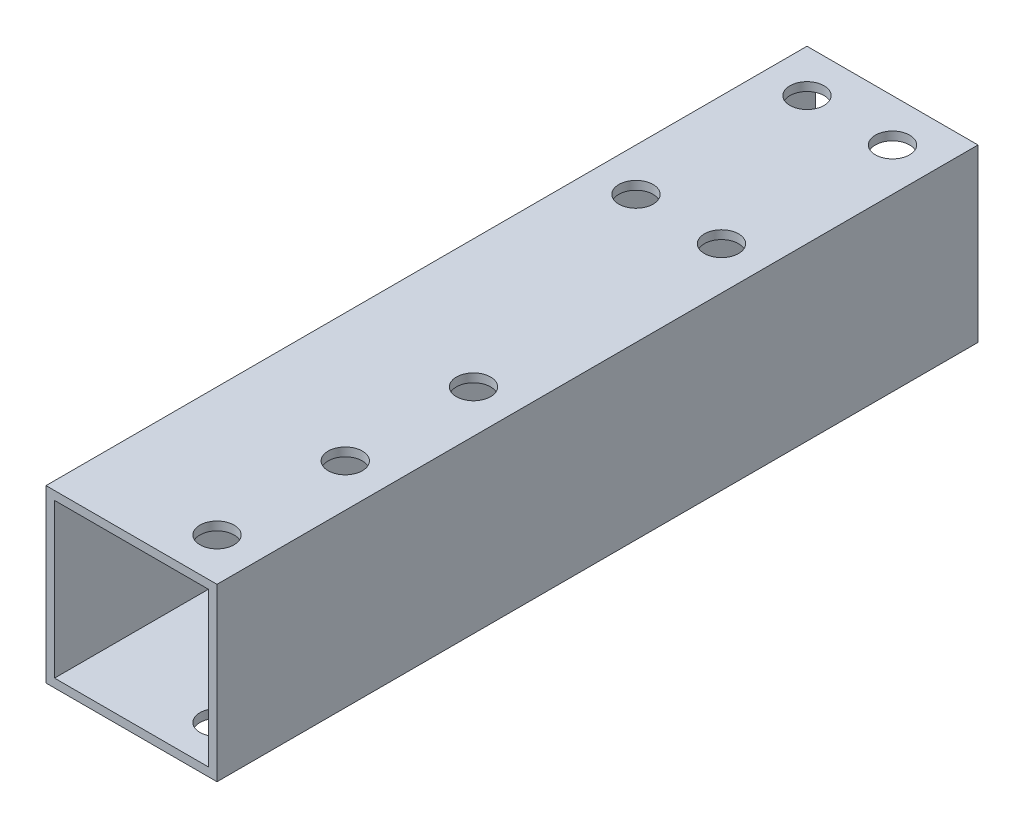
ISO-10303-21;
HEADER;
FILE_DESCRIPTION(('STEP AP214'),'2;1');
FILE_NAME('part.step','',(''),(''),'','','');
FILE_SCHEMA(('AUTOMOTIVE_DESIGN { 1 0 10303 214 1 1 1 1 }'));
ENDSEC;
DATA;
#1=APPLICATION_CONTEXT('core data for automotive mechanical design processes');
#2=APPLICATION_PROTOCOL_DEFINITION('international standard','automotive_design',2000,#1);
#3=PRODUCT_CONTEXT('',#1,'mechanical');
#4=PRODUCT('Part','Part','',(#3));
#5=PRODUCT_RELATED_PRODUCT_CATEGORY('part','',(#4));
#6=PRODUCT_DEFINITION_FORMATION('','',#4);
#7=PRODUCT_DEFINITION_CONTEXT('part definition',#1,'design');
#8=PRODUCT_DEFINITION('design','',#6,#7);
#9=PRODUCT_DEFINITION_SHAPE('','',#8);
#10=(LENGTH_UNIT() NAMED_UNIT(*) SI_UNIT(.MILLI.,.METRE.));
#11=(NAMED_UNIT(*) PLANE_ANGLE_UNIT() SI_UNIT($,.RADIAN.));
#12=(NAMED_UNIT(*) SI_UNIT($,.STERADIAN.) SOLID_ANGLE_UNIT());
#13=UNCERTAINTY_MEASURE_WITH_UNIT(LENGTH_MEASURE(1.E-05),#10,'distance_accuracy_value','');
#14=(GEOMETRIC_REPRESENTATION_CONTEXT(3) GLOBAL_UNCERTAINTY_ASSIGNED_CONTEXT((#13)) GLOBAL_UNIT_ASSIGNED_CONTEXT((#10,
#11,#12)) REPRESENTATION_CONTEXT('',''));
#15=CARTESIAN_POINT('',(0.,0.,0.));
#16=DIRECTION('',(0.,0.,1.));
#17=DIRECTION('',(1.,0.,0.));
#18=AXIS2_PLACEMENT_3D('',#15,#16,#17);
#19=CARTESIAN_POINT('',(0.,0.,89.));
#20=DIRECTION('',(0.,0.,1.));
#21=DIRECTION('',(1.,0.,0.));
#22=AXIS2_PLACEMENT_3D('',#19,#20,#21);
#23=PLANE('',#22);
#24=DIRECTION('',(0.,-1.,0.));
#25=VECTOR('',#24,1.);
#26=CARTESIAN_POINT('',(0.,0.,89.));
#27=LINE('',#26,#25);
#28=CARTESIAN_POINT('',(0.,20.,89.));
#29=VERTEX_POINT('',#28);
#30=CARTESIAN_POINT('',(0.,0.,89.));
#31=VERTEX_POINT('',#30);
#32=EDGE_CURVE('E165',#29,#31,#27,.T.);
#33=ORIENTED_EDGE('',*,*,#32,.T.);
#34=DIRECTION('',(1.,0.,0.));
#35=VECTOR('',#34,1.);
#36=CARTESIAN_POINT('',(0.,0.,89.));
#37=LINE('',#36,#35);
#38=CARTESIAN_POINT('',(20.,0.,89.));
#39=VERTEX_POINT('',#38);
#40=EDGE_CURVE('E168',#31,#39,#37,.T.);
#41=ORIENTED_EDGE('',*,*,#40,.T.);
#42=DIRECTION('',(0.,1.,0.));
#43=VECTOR('',#42,1.);
#44=CARTESIAN_POINT('',(20.,0.,89.));
#45=LINE('',#44,#43);
#46=CARTESIAN_POINT('',(20.,20.,89.));
#47=VERTEX_POINT('',#46);
#48=EDGE_CURVE('E171',#39,#47,#45,.T.);
#49=ORIENTED_EDGE('',*,*,#48,.T.);
#50=DIRECTION('',(-1.,0.,0.));
#51=VECTOR('',#50,1.);
#52=CARTESIAN_POINT('',(0.,20.,89.));
#53=LINE('',#52,#51);
#54=EDGE_CURVE('E173',#47,#29,#53,.T.);
#55=ORIENTED_EDGE('',*,*,#54,.T.);
#56=EDGE_LOOP('',(#33,#41,#49,#55));
#57=FACE_BOUND('',#56,.T.);
#58=DIRECTION('',(1.,0.,0.));
#59=VECTOR('',#58,1.);
#60=CARTESIAN_POINT('',(0.,1.,89.));
#61=LINE('',#60,#59);
#62=CARTESIAN_POINT('',(1.,1.,89.));
#63=VERTEX_POINT('',#62);
#64=CARTESIAN_POINT('',(19.,1.,89.));
#65=VERTEX_POINT('',#64);
#66=EDGE_CURVE('E135',#63,#65,#61,.T.);
#67=ORIENTED_EDGE('',*,*,#66,.F.);
#68=DIRECTION('',(0.,-1.,0.));
#69=VECTOR('',#68,1.);
#70=CARTESIAN_POINT('',(1.,0.,89.));
#71=LINE('',#70,#69);
#72=CARTESIAN_POINT('',(1.,19.,89.));
#73=VERTEX_POINT('',#72);
#74=EDGE_CURVE('E127',#73,#63,#71,.T.);
#75=ORIENTED_EDGE('',*,*,#74,.F.);
#76=DIRECTION('',(-1.,0.,0.));
#77=VECTOR('',#76,1.);
#78=CARTESIAN_POINT('',(0.,19.,89.));
#79=LINE('',#78,#77);
#80=CARTESIAN_POINT('',(19.,19.,89.));
#81=VERTEX_POINT('',#80);
#82=EDGE_CURVE('E149',#81,#73,#79,.T.);
#83=ORIENTED_EDGE('',*,*,#82,.F.);
#84=DIRECTION('',(0.,1.,0.));
#85=VECTOR('',#84,1.);
#86=CARTESIAN_POINT('',(19.,0.,89.));
#87=LINE('',#86,#85);
#88=EDGE_CURVE('E147',#65,#81,#87,.T.);
#89=ORIENTED_EDGE('',*,*,#88,.F.);
#90=EDGE_LOOP('',(#67,#75,#83,#89));
#91=FACE_BOUND('',#90,.T.);
#92=ADVANCED_FACE('F60',(#57,#91),#23,.T.);
#93=CARTESIAN_POINT('',(0.,0.,0.));
#94=DIRECTION('',(0.,0.,1.));
#95=DIRECTION('',(1.,0.,0.));
#96=AXIS2_PLACEMENT_3D('',#93,#94,#95);
#97=PLANE('',#96);
#98=DIRECTION('',(0.,-1.,0.));
#99=VECTOR('',#98,1.);
#100=CARTESIAN_POINT('',(0.,0.,0.));
#101=LINE('',#100,#99);
#102=CARTESIAN_POINT('',(0.,20.,0.));
#103=VERTEX_POINT('',#102);
#104=CARTESIAN_POINT('',(0.,0.,0.));
#105=VERTEX_POINT('',#104);
#106=EDGE_CURVE('E143',#103,#105,#101,.T.);
#107=ORIENTED_EDGE('',*,*,#106,.F.);
#108=DIRECTION('',(-1.,0.,0.));
#109=VECTOR('',#108,1.);
#110=CARTESIAN_POINT('',(0.,20.,0.));
#111=LINE('',#110,#109);
#112=CARTESIAN_POINT('',(20.,20.,0.));
#113=VERTEX_POINT('',#112);
#114=EDGE_CURVE('E169',#113,#103,#111,.T.);
#115=ORIENTED_EDGE('',*,*,#114,.F.);
#116=DIRECTION('',(0.,1.,0.));
#117=VECTOR('',#116,1.);
#118=CARTESIAN_POINT('',(20.,0.,0.));
#119=LINE('',#118,#117);
#120=CARTESIAN_POINT('',(20.,0.,0.));
#121=VERTEX_POINT('',#120);
#122=EDGE_CURVE('E180',#121,#113,#119,.T.);
#123=ORIENTED_EDGE('',*,*,#122,.F.);
#124=DIRECTION('',(1.,0.,0.));
#125=VECTOR('',#124,1.);
#126=CARTESIAN_POINT('',(0.,0.,0.));
#127=LINE('',#126,#125);
#128=EDGE_CURVE('E178',#105,#121,#127,.T.);
#129=ORIENTED_EDGE('',*,*,#128,.F.);
#130=EDGE_LOOP('',(#107,#115,#123,#129));
#131=FACE_BOUND('',#130,.T.);
#132=DIRECTION('',(0.,-1.,0.));
#133=VECTOR('',#132,1.);
#134=CARTESIAN_POINT('',(1.,0.,0.));
#135=LINE('',#134,#133);
#136=CARTESIAN_POINT('',(1.,19.,0.));
#137=VERTEX_POINT('',#136);
#138=CARTESIAN_POINT('',(1.,1.,0.));
#139=VERTEX_POINT('',#138);
#140=EDGE_CURVE('E85',#137,#139,#135,.T.);
#141=ORIENTED_EDGE('',*,*,#140,.T.);
#142=DIRECTION('',(1.,0.,0.));
#143=VECTOR('',#142,1.);
#144=CARTESIAN_POINT('',(0.,1.,0.));
#145=LINE('',#144,#143);
#146=CARTESIAN_POINT('',(19.,1.,0.));
#147=VERTEX_POINT('',#146);
#148=EDGE_CURVE('E142',#139,#147,#145,.T.);
#149=ORIENTED_EDGE('',*,*,#148,.T.);
#150=DIRECTION('',(0.,1.,0.));
#151=VECTOR('',#150,1.);
#152=CARTESIAN_POINT('',(19.,0.,0.));
#153=LINE('',#152,#151);
#154=CARTESIAN_POINT('',(19.,19.,0.));
#155=VERTEX_POINT('',#154);
#156=EDGE_CURVE('E157',#147,#155,#153,.T.);
#157=ORIENTED_EDGE('',*,*,#156,.T.);
#158=DIRECTION('',(-1.,0.,0.));
#159=VECTOR('',#158,1.);
#160=CARTESIAN_POINT('',(0.,19.,0.));
#161=LINE('',#160,#159);
#162=EDGE_CURVE('E136',#155,#137,#161,.T.);
#163=ORIENTED_EDGE('',*,*,#162,.T.);
#164=EDGE_LOOP('',(#141,#149,#157,#163));
#165=FACE_BOUND('',#164,.T.);
#166=ADVANCED_FACE('F250',(#131,#165),#97,.F.);
#167=CARTESIAN_POINT('',(0.,0.,89.));
#168=DIRECTION('',(1.,0.,0.));
#169=DIRECTION('',(0.,0.,-1.));
#170=AXIS2_PLACEMENT_3D('',#167,#168,#169);
#171=PLANE('',#170);
#172=ORIENTED_EDGE('',*,*,#106,.T.);
#173=DIRECTION('',(0.,0.,-1.));
#174=VECTOR('',#173,1.);
#175=CARTESIAN_POINT('',(0.,0.,89.));
#176=LINE('',#175,#174);
#177=EDGE_CURVE('E12',#31,#105,#176,.T.);
#178=ORIENTED_EDGE('',*,*,#177,.F.);
#179=ORIENTED_EDGE('',*,*,#32,.F.);
#180=DIRECTION('',(0.,0.,-1.));
#181=VECTOR('',#180,1.);
#182=CARTESIAN_POINT('',(0.,20.,89.));
#183=LINE('',#182,#181);
#184=EDGE_CURVE('E175',#29,#103,#183,.T.);
#185=ORIENTED_EDGE('',*,*,#184,.T.);
#186=EDGE_LOOP('',(#172,#178,#179,#185));
#187=FACE_BOUND('',#186,.T.);
#188=ADVANCED_FACE('F62',(#187),#171,.F.);
#189=CARTESIAN_POINT('',(0.,0.,89.));
#190=DIRECTION('',(0.,1.,0.));
#191=DIRECTION('',(0.,0.,1.));
#192=AXIS2_PLACEMENT_3D('',#189,#190,#191);
#193=PLANE('',#192);
#194=CARTESIAN_POINT('',(15.,0.,84.));
#195=DIRECTION('',(0.,1.,0.));
#196=DIRECTION('',(0.,0.,1.));
#197=AXIS2_PLACEMENT_3D('',#194,#195,#196);
#198=CIRCLE('',#197,2.00000000000001);
#199=CARTESIAN_POINT('',(15.,0.,86.));
#200=VERTEX_POINT('',#199);
#201=EDGE_CURVE('E286',#200,#200,#198,.T.);
#202=ORIENTED_EDGE('',*,*,#201,.T.);
#203=EDGE_LOOP('',(#202));
#204=FACE_BOUND('',#203,.T.);
#205=CARTESIAN_POINT('',(15.,0.,25.));
#206=DIRECTION('',(0.,1.,0.));
#207=DIRECTION('',(0.,0.,1.));
#208=AXIS2_PLACEMENT_3D('',#205,#206,#207);
#209=CIRCLE('',#208,2.);
#210=CARTESIAN_POINT('',(15.,0.,27.));
#211=VERTEX_POINT('',#210);
#212=EDGE_CURVE('E290',#211,#211,#209,.T.);
#213=ORIENTED_EDGE('',*,*,#212,.T.);
#214=EDGE_LOOP('',(#213));
#215=FACE_BOUND('',#214,.T.);
#216=CARTESIAN_POINT('',(5.,0.,25.));
#217=DIRECTION('',(0.,1.,0.));
#218=DIRECTION('',(0.,0.,1.));
#219=AXIS2_PLACEMENT_3D('',#216,#217,#218);
#220=CIRCLE('',#219,2.);
#221=CARTESIAN_POINT('',(5.,0.,27.));
#222=VERTEX_POINT('',#221);
#223=EDGE_CURVE('E294',#222,#222,#220,.T.);
#224=ORIENTED_EDGE('',*,*,#223,.T.);
#225=EDGE_LOOP('',(#224));
#226=FACE_BOUND('',#225,.T.);
#227=CARTESIAN_POINT('',(15.,0.,5.));
#228=DIRECTION('',(0.,1.,0.));
#229=DIRECTION('',(0.,0.,1.));
#230=AXIS2_PLACEMENT_3D('',#227,#228,#229);
#231=CIRCLE('',#230,2.);
#232=CARTESIAN_POINT('',(15.,0.,7.));
#233=VERTEX_POINT('',#232);
#234=EDGE_CURVE('E298',#233,#233,#231,.T.);
#235=ORIENTED_EDGE('',*,*,#234,.T.);
#236=EDGE_LOOP('',(#235));
#237=FACE_BOUND('',#236,.T.);
#238=CARTESIAN_POINT('',(15.,0.,69.));
#239=DIRECTION('',(0.,1.,0.));
#240=DIRECTION('',(0.,0.,1.));
#241=AXIS2_PLACEMENT_3D('',#238,#239,#240);
#242=CIRCLE('',#241,2.00000000000001);
#243=CARTESIAN_POINT('',(15.,0.,71.));
#244=VERTEX_POINT('',#243);
#245=EDGE_CURVE('E302',#244,#244,#242,.T.);
#246=ORIENTED_EDGE('',*,*,#245,.T.);
#247=EDGE_LOOP('',(#246));
#248=FACE_BOUND('',#247,.T.);
#249=CARTESIAN_POINT('',(15.,0.,54.));
#250=DIRECTION('',(0.,1.,0.));
#251=DIRECTION('',(0.,0.,1.));
#252=AXIS2_PLACEMENT_3D('',#249,#250,#251);
#253=CIRCLE('',#252,2.00000000000001);
#254=CARTESIAN_POINT('',(15.,0.,56.));
#255=VERTEX_POINT('',#254);
#256=EDGE_CURVE('E306',#255,#255,#253,.T.);
#257=ORIENTED_EDGE('',*,*,#256,.T.);
#258=EDGE_LOOP('',(#257));
#259=FACE_BOUND('',#258,.T.);
#260=CARTESIAN_POINT('',(5.,0.,5.));
#261=DIRECTION('',(0.,1.,0.));
#262=DIRECTION('',(0.,0.,1.));
#263=AXIS2_PLACEMENT_3D('',#260,#261,#262);
#264=CIRCLE('',#263,2.);
#265=CARTESIAN_POINT('',(5.,0.,7.));
#266=VERTEX_POINT('',#265);
#267=EDGE_CURVE('E194',#266,#266,#264,.T.);
#268=ORIENTED_EDGE('',*,*,#267,.T.);
#269=EDGE_LOOP('',(#268));
#270=FACE_BOUND('',#269,.T.);
#271=ORIENTED_EDGE('',*,*,#128,.T.);
#272=DIRECTION('',(0.,0.,-1.));
#273=VECTOR('',#272,1.);
#274=CARTESIAN_POINT('',(20.,0.,89.));
#275=LINE('',#274,#273);
#276=EDGE_CURVE('E69',#39,#121,#275,.T.);
#277=ORIENTED_EDGE('',*,*,#276,.F.);
#278=ORIENTED_EDGE('',*,*,#40,.F.);
#279=ORIENTED_EDGE('',*,*,#177,.T.);
#280=EDGE_LOOP('',(#271,#277,#278,#279));
#281=FACE_BOUND('',#280,.T.);
#282=ADVANCED_FACE('F275',(#204,#215,#226,#237,#248,#259,#270,#281),#193,.F.);
#283=CARTESIAN_POINT('',(20.,0.,89.));
#284=DIRECTION('',(-1.,0.,0.));
#285=DIRECTION('',(0.,0.,1.));
#286=AXIS2_PLACEMENT_3D('',#283,#284,#285);
#287=PLANE('',#286);
#288=ORIENTED_EDGE('',*,*,#122,.T.);
#289=DIRECTION('',(0.,0.,-1.));
#290=VECTOR('',#289,1.);
#291=CARTESIAN_POINT('',(20.,20.,89.));
#292=LINE('',#291,#290);
#293=EDGE_CURVE('E185',#47,#113,#292,.T.);
#294=ORIENTED_EDGE('',*,*,#293,.F.);
#295=ORIENTED_EDGE('',*,*,#48,.F.);
#296=ORIENTED_EDGE('',*,*,#276,.T.);
#297=EDGE_LOOP('',(#288,#294,#295,#296));
#298=FACE_BOUND('',#297,.T.);
#299=ADVANCED_FACE('F272',(#298),#287,.F.);
#300=CARTESIAN_POINT('',(0.,20.,89.));
#301=DIRECTION('',(0.,-1.,0.));
#302=DIRECTION('',(0.,0.,-1.));
#303=AXIS2_PLACEMENT_3D('',#300,#301,#302);
#304=PLANE('',#303);
#305=CARTESIAN_POINT('',(15.,20.,84.));
#306=DIRECTION('',(0.,1.,0.));
#307=DIRECTION('',(0.,0.,1.));
#308=AXIS2_PLACEMENT_3D('',#305,#306,#307);
#309=CIRCLE('',#308,2.00000000000001);
#310=CARTESIAN_POINT('',(15.,20.,86.));
#311=VERTEX_POINT('',#310);
#312=EDGE_CURVE('E404',#311,#311,#309,.T.);
#313=ORIENTED_EDGE('',*,*,#312,.F.);
#314=EDGE_LOOP('',(#313));
#315=FACE_BOUND('',#314,.T.);
#316=CARTESIAN_POINT('',(15.,20.,25.));
#317=DIRECTION('',(0.,1.,0.));
#318=DIRECTION('',(0.,0.,1.));
#319=AXIS2_PLACEMENT_3D('',#316,#317,#318);
#320=CIRCLE('',#319,2.);
#321=CARTESIAN_POINT('',(15.,20.,27.));
#322=VERTEX_POINT('',#321);
#323=EDGE_CURVE('E408',#322,#322,#320,.T.);
#324=ORIENTED_EDGE('',*,*,#323,.F.);
#325=EDGE_LOOP('',(#324));
#326=FACE_BOUND('',#325,.T.);
#327=CARTESIAN_POINT('',(5.,20.,25.));
#328=DIRECTION('',(0.,1.,0.));
#329=DIRECTION('',(0.,0.,1.));
#330=AXIS2_PLACEMENT_3D('',#327,#328,#329);
#331=CIRCLE('',#330,2.);
#332=CARTESIAN_POINT('',(5.,20.,27.));
#333=VERTEX_POINT('',#332);
#334=EDGE_CURVE('E327',#333,#333,#331,.T.);
#335=ORIENTED_EDGE('',*,*,#334,.F.);
#336=EDGE_LOOP('',(#335));
#337=FACE_BOUND('',#336,.T.);
#338=CARTESIAN_POINT('',(15.,20.,5.));
#339=DIRECTION('',(0.,1.,0.));
#340=DIRECTION('',(0.,0.,1.));
#341=AXIS2_PLACEMENT_3D('',#338,#339,#340);
#342=CIRCLE('',#341,2.);
#343=CARTESIAN_POINT('',(15.,20.,7.));
#344=VERTEX_POINT('',#343);
#345=EDGE_CURVE('E398',#344,#344,#342,.T.);
#346=ORIENTED_EDGE('',*,*,#345,.F.);
#347=EDGE_LOOP('',(#346));
#348=FACE_BOUND('',#347,.T.);
#349=CARTESIAN_POINT('',(15.,20.,69.));
#350=DIRECTION('',(0.,1.,0.));
#351=DIRECTION('',(0.,0.,1.));
#352=AXIS2_PLACEMENT_3D('',#349,#350,#351);
#353=CIRCLE('',#352,2.00000000000001);
#354=CARTESIAN_POINT('',(15.,20.,71.));
#355=VERTEX_POINT('',#354);
#356=EDGE_CURVE('E416',#355,#355,#353,.T.);
#357=ORIENTED_EDGE('',*,*,#356,.F.);
#358=EDGE_LOOP('',(#357));
#359=FACE_BOUND('',#358,.T.);
#360=CARTESIAN_POINT('',(15.,20.,54.));
#361=DIRECTION('',(0.,1.,0.));
#362=DIRECTION('',(0.,0.,1.));
#363=AXIS2_PLACEMENT_3D('',#360,#361,#362);
#364=CIRCLE('',#363,2.00000000000001);
#365=CARTESIAN_POINT('',(15.,20.,56.));
#366=VERTEX_POINT('',#365);
#367=EDGE_CURVE('E412',#366,#366,#364,.T.);
#368=ORIENTED_EDGE('',*,*,#367,.F.);
#369=EDGE_LOOP('',(#368));
#370=FACE_BOUND('',#369,.T.);
#371=CARTESIAN_POINT('',(5.,20.,5.));
#372=DIRECTION('',(0.,1.,0.));
#373=DIRECTION('',(0.,0.,1.));
#374=AXIS2_PLACEMENT_3D('',#371,#372,#373);
#375=CIRCLE('',#374,2.);
#376=CARTESIAN_POINT('',(5.,20.,7.));
#377=VERTEX_POINT('',#376);
#378=EDGE_CURVE('E322',#377,#377,#375,.T.);
#379=ORIENTED_EDGE('',*,*,#378,.F.);
#380=EDGE_LOOP('',(#379));
#381=FACE_BOUND('',#380,.T.);
#382=ORIENTED_EDGE('',*,*,#114,.T.);
#383=ORIENTED_EDGE('',*,*,#184,.F.);
#384=ORIENTED_EDGE('',*,*,#54,.F.);
#385=ORIENTED_EDGE('',*,*,#293,.T.);
#386=EDGE_LOOP('',(#382,#383,#384,#385));
#387=FACE_BOUND('',#386,.T.);
#388=ADVANCED_FACE('F269',(#315,#326,#337,#348,#359,#370,#381,#387),#304,.F.);
#389=CARTESIAN_POINT('',(1.,0.,89.));
#390=DIRECTION('',(1.,0.,0.));
#391=DIRECTION('',(0.,0.,-1.));
#392=AXIS2_PLACEMENT_3D('',#389,#390,#391);
#393=PLANE('',#392);
#394=ORIENTED_EDGE('',*,*,#140,.F.);
#395=DIRECTION('',(0.,0.,-1.));
#396=VECTOR('',#395,1.);
#397=CARTESIAN_POINT('',(1.,19.,89.));
#398=LINE('',#397,#396);
#399=EDGE_CURVE('E131',#73,#137,#398,.T.);
#400=ORIENTED_EDGE('',*,*,#399,.F.);
#401=ORIENTED_EDGE('',*,*,#74,.T.);
#402=DIRECTION('',(0.,0.,-1.));
#403=VECTOR('',#402,1.);
#404=CARTESIAN_POINT('',(1.,1.,89.));
#405=LINE('',#404,#403);
#406=EDGE_CURVE('E130',#63,#139,#405,.T.);
#407=ORIENTED_EDGE('',*,*,#406,.T.);
#408=EDGE_LOOP('',(#394,#400,#401,#407));
#409=FACE_BOUND('',#408,.T.);
#410=ADVANCED_FACE('F129',(#409),#393,.T.);
#411=CARTESIAN_POINT('',(0.,1.,89.));
#412=DIRECTION('',(0.,1.,0.));
#413=DIRECTION('',(0.,0.,1.));
#414=AXIS2_PLACEMENT_3D('',#411,#412,#413);
#415=PLANE('',#414);
#416=CARTESIAN_POINT('',(15.,1.,84.));
#417=DIRECTION('',(0.,1.,0.));
#418=DIRECTION('',(0.,0.,1.));
#419=AXIS2_PLACEMENT_3D('',#416,#417,#418);
#420=CIRCLE('',#419,2.00000000000001);
#421=CARTESIAN_POINT('',(15.,1.,86.));
#422=VERTEX_POINT('',#421);
#423=EDGE_CURVE('E155',#422,#422,#420,.T.);
#424=ORIENTED_EDGE('',*,*,#423,.F.);
#425=EDGE_LOOP('',(#424));
#426=FACE_BOUND('',#425,.T.);
#427=CARTESIAN_POINT('',(15.,1.,25.));
#428=DIRECTION('',(0.,1.,0.));
#429=DIRECTION('',(0.,0.,1.));
#430=AXIS2_PLACEMENT_3D('',#427,#428,#429);
#431=CIRCLE('',#430,2.);
#432=CARTESIAN_POINT('',(15.,1.,27.));
#433=VERTEX_POINT('',#432);
#434=EDGE_CURVE('E212',#433,#433,#431,.T.);
#435=ORIENTED_EDGE('',*,*,#434,.F.);
#436=EDGE_LOOP('',(#435));
#437=FACE_BOUND('',#436,.T.);
#438=CARTESIAN_POINT('',(5.,1.,25.));
#439=DIRECTION('',(0.,1.,0.));
#440=DIRECTION('',(0.,0.,1.));
#441=AXIS2_PLACEMENT_3D('',#438,#439,#440);
#442=CIRCLE('',#441,2.);
#443=CARTESIAN_POINT('',(5.,1.,27.));
#444=VERTEX_POINT('',#443);
#445=EDGE_CURVE('E209',#444,#444,#442,.T.);
#446=ORIENTED_EDGE('',*,*,#445,.F.);
#447=EDGE_LOOP('',(#446));
#448=FACE_BOUND('',#447,.T.);
#449=CARTESIAN_POINT('',(15.,1.,5.));
#450=DIRECTION('',(0.,1.,0.));
#451=DIRECTION('',(0.,0.,1.));
#452=AXIS2_PLACEMENT_3D('',#449,#450,#451);
#453=CIRCLE('',#452,2.);
#454=CARTESIAN_POINT('',(15.,1.,7.));
#455=VERTEX_POINT('',#454);
#456=EDGE_CURVE('E206',#455,#455,#453,.T.);
#457=ORIENTED_EDGE('',*,*,#456,.F.);
#458=EDGE_LOOP('',(#457));
#459=FACE_BOUND('',#458,.T.);
#460=CARTESIAN_POINT('',(15.,1.,69.));
#461=DIRECTION('',(0.,1.,0.));
#462=DIRECTION('',(0.,0.,1.));
#463=AXIS2_PLACEMENT_3D('',#460,#461,#462);
#464=CIRCLE('',#463,2.00000000000001);
#465=CARTESIAN_POINT('',(15.,1.,71.));
#466=VERTEX_POINT('',#465);
#467=EDGE_CURVE('E202',#466,#466,#464,.T.);
#468=ORIENTED_EDGE('',*,*,#467,.F.);
#469=EDGE_LOOP('',(#468));
#470=FACE_BOUND('',#469,.T.);
#471=CARTESIAN_POINT('',(15.,1.,54.));
#472=DIRECTION('',(0.,1.,0.));
#473=DIRECTION('',(0.,0.,1.));
#474=AXIS2_PLACEMENT_3D('',#471,#472,#473);
#475=CIRCLE('',#474,2.00000000000001);
#476=CARTESIAN_POINT('',(15.,1.,56.));
#477=VERTEX_POINT('',#476);
#478=EDGE_CURVE('E198',#477,#477,#475,.T.);
#479=ORIENTED_EDGE('',*,*,#478,.F.);
#480=EDGE_LOOP('',(#479));
#481=FACE_BOUND('',#480,.T.);
#482=CARTESIAN_POINT('',(5.,1.,5.));
#483=DIRECTION('',(0.,1.,0.));
#484=DIRECTION('',(0.,0.,1.));
#485=AXIS2_PLACEMENT_3D('',#482,#483,#484);
#486=CIRCLE('',#485,2.);
#487=CARTESIAN_POINT('',(5.,1.,7.));
#488=VERTEX_POINT('',#487);
#489=EDGE_CURVE('E193',#488,#488,#486,.T.);
#490=ORIENTED_EDGE('',*,*,#489,.F.);
#491=EDGE_LOOP('',(#490));
#492=FACE_BOUND('',#491,.T.);
#493=ORIENTED_EDGE('',*,*,#148,.F.);
#494=ORIENTED_EDGE('',*,*,#406,.F.);
#495=ORIENTED_EDGE('',*,*,#66,.T.);
#496=DIRECTION('',(0.,0.,-1.));
#497=VECTOR('',#496,1.);
#498=CARTESIAN_POINT('',(19.,1.,89.));
#499=LINE('',#498,#497);
#500=EDGE_CURVE('E144',#65,#147,#499,.T.);
#501=ORIENTED_EDGE('',*,*,#500,.T.);
#502=EDGE_LOOP('',(#493,#494,#495,#501));
#503=FACE_BOUND('',#502,.T.);
#504=ADVANCED_FACE('F139',(#426,#437,#448,#459,#470,#481,#492,#503),#415,.T.);
#505=CARTESIAN_POINT('',(19.,0.,89.));
#506=DIRECTION('',(-1.,0.,0.));
#507=DIRECTION('',(0.,0.,1.));
#508=AXIS2_PLACEMENT_3D('',#505,#506,#507);
#509=PLANE('',#508);
#510=ORIENTED_EDGE('',*,*,#156,.F.);
#511=ORIENTED_EDGE('',*,*,#500,.F.);
#512=ORIENTED_EDGE('',*,*,#88,.T.);
#513=DIRECTION('',(0.,0.,-1.));
#514=VECTOR('',#513,1.);
#515=CARTESIAN_POINT('',(19.,19.,89.));
#516=LINE('',#515,#514);
#517=EDGE_CURVE('E77',#81,#155,#516,.T.);
#518=ORIENTED_EDGE('',*,*,#517,.T.);
#519=EDGE_LOOP('',(#510,#511,#512,#518));
#520=FACE_BOUND('',#519,.T.);
#521=ADVANCED_FACE('F236',(#520),#509,.T.);
#522=CARTESIAN_POINT('',(0.,19.,89.));
#523=DIRECTION('',(0.,-1.,0.));
#524=DIRECTION('',(0.,0.,-1.));
#525=AXIS2_PLACEMENT_3D('',#522,#523,#524);
#526=PLANE('',#525);
#527=CARTESIAN_POINT('',(15.,19.,84.));
#528=DIRECTION('',(0.,-1.,0.));
#529=DIRECTION('',(0.,0.,-1.));
#530=AXIS2_PLACEMENT_3D('',#527,#528,#529);
#531=CIRCLE('',#530,2.00000000000001);
#532=CARTESIAN_POINT('',(15.,19.,82.));
#533=VERTEX_POINT('',#532);
#534=EDGE_CURVE('E64',#533,#533,#531,.T.);
#535=ORIENTED_EDGE('',*,*,#534,.F.);
#536=EDGE_LOOP('',(#535));
#537=FACE_BOUND('',#536,.T.);
#538=CARTESIAN_POINT('',(15.,19.,25.));
#539=DIRECTION('',(0.,-1.,0.));
#540=DIRECTION('',(0.,0.,-1.));
#541=AXIS2_PLACEMENT_3D('',#538,#539,#540);
#542=CIRCLE('',#541,2.);
#543=CARTESIAN_POINT('',(15.,19.,23.));
#544=VERTEX_POINT('',#543);
#545=EDGE_CURVE('E210',#544,#544,#542,.T.);
#546=ORIENTED_EDGE('',*,*,#545,.F.);
#547=EDGE_LOOP('',(#546));
#548=FACE_BOUND('',#547,.T.);
#549=CARTESIAN_POINT('',(5.,19.,25.));
#550=DIRECTION('',(0.,-1.,0.));
#551=DIRECTION('',(0.,0.,-1.));
#552=AXIS2_PLACEMENT_3D('',#549,#550,#551);
#553=CIRCLE('',#552,2.);
#554=CARTESIAN_POINT('',(5.,19.,23.));
#555=VERTEX_POINT('',#554);
#556=EDGE_CURVE('E207',#555,#555,#553,.T.);
#557=ORIENTED_EDGE('',*,*,#556,.F.);
#558=EDGE_LOOP('',(#557));
#559=FACE_BOUND('',#558,.T.);
#560=CARTESIAN_POINT('',(15.,19.,5.));
#561=DIRECTION('',(0.,-1.,0.));
#562=DIRECTION('',(0.,0.,-1.));
#563=AXIS2_PLACEMENT_3D('',#560,#561,#562);
#564=CIRCLE('',#563,2.);
#565=CARTESIAN_POINT('',(15.,19.,3.));
#566=VERTEX_POINT('',#565);
#567=EDGE_CURVE('E203',#566,#566,#564,.T.);
#568=ORIENTED_EDGE('',*,*,#567,.F.);
#569=EDGE_LOOP('',(#568));
#570=FACE_BOUND('',#569,.T.);
#571=CARTESIAN_POINT('',(15.,19.,69.));
#572=DIRECTION('',(0.,-1.,0.));
#573=DIRECTION('',(0.,0.,-1.));
#574=AXIS2_PLACEMENT_3D('',#571,#572,#573);
#575=CIRCLE('',#574,2.00000000000001);
#576=CARTESIAN_POINT('',(15.,19.,67.));
#577=VERTEX_POINT('',#576);
#578=EDGE_CURVE('E199',#577,#577,#575,.T.);
#579=ORIENTED_EDGE('',*,*,#578,.F.);
#580=EDGE_LOOP('',(#579));
#581=FACE_BOUND('',#580,.T.);
#582=CARTESIAN_POINT('',(15.,19.,54.));
#583=DIRECTION('',(0.,-1.,0.));
#584=DIRECTION('',(0.,0.,-1.));
#585=AXIS2_PLACEMENT_3D('',#582,#583,#584);
#586=CIRCLE('',#585,2.00000000000001);
#587=CARTESIAN_POINT('',(15.,19.,52.));
#588=VERTEX_POINT('',#587);
#589=EDGE_CURVE('E195',#588,#588,#586,.T.);
#590=ORIENTED_EDGE('',*,*,#589,.F.);
#591=EDGE_LOOP('',(#590));
#592=FACE_BOUND('',#591,.T.);
#593=CARTESIAN_POINT('',(5.,19.,5.));
#594=DIRECTION('',(0.,-1.,0.));
#595=DIRECTION('',(0.,0.,-1.));
#596=AXIS2_PLACEMENT_3D('',#593,#594,#595);
#597=CIRCLE('',#596,2.);
#598=CARTESIAN_POINT('',(5.,19.,3.));
#599=VERTEX_POINT('',#598);
#600=EDGE_CURVE('E190',#599,#599,#597,.T.);
#601=ORIENTED_EDGE('',*,*,#600,.F.);
#602=EDGE_LOOP('',(#601));
#603=FACE_BOUND('',#602,.T.);
#604=ORIENTED_EDGE('',*,*,#162,.F.);
#605=ORIENTED_EDGE('',*,*,#517,.F.);
#606=ORIENTED_EDGE('',*,*,#82,.T.);
#607=ORIENTED_EDGE('',*,*,#399,.T.);
#608=EDGE_LOOP('',(#604,#605,#606,#607));
#609=FACE_BOUND('',#608,.T.);
#610=ADVANCED_FACE('F232',(#537,#548,#559,#570,#581,#592,#603,#609),#526,.T.);
#611=CARTESIAN_POINT('',(5.,0.,5.));
#612=DIRECTION('',(0.,1.,0.));
#613=DIRECTION('',(0.,0.,1.));
#614=AXIS2_PLACEMENT_3D('',#611,#612,#613);
#615=CYLINDRICAL_SURFACE('',#614,2.);
#616=ORIENTED_EDGE('',*,*,#600,.T.);
#617=EDGE_LOOP('',(#616));
#618=FACE_BOUND('',#617,.T.);
#619=ORIENTED_EDGE('',*,*,#378,.T.);
#620=EDGE_LOOP('',(#619));
#621=FACE_BOUND('',#620,.T.);
#622=ADVANCED_FACE('F235',(#618,#621),#615,.F.);
#623=CARTESIAN_POINT('',(15.,0.,54.));
#624=DIRECTION('',(0.,1.,0.));
#625=DIRECTION('',(0.,0.,1.));
#626=AXIS2_PLACEMENT_3D('',#623,#624,#625);
#627=CYLINDRICAL_SURFACE('',#626,2.00000000000001);
#628=ORIENTED_EDGE('',*,*,#589,.T.);
#629=EDGE_LOOP('',(#628));
#630=FACE_BOUND('',#629,.T.);
#631=ORIENTED_EDGE('',*,*,#367,.T.);
#632=EDGE_LOOP('',(#631));
#633=FACE_BOUND('',#632,.T.);
#634=ADVANCED_FACE('F354',(#630,#633),#627,.F.);
#635=CARTESIAN_POINT('',(15.,0.,69.));
#636=DIRECTION('',(0.,1.,0.));
#637=DIRECTION('',(0.,0.,1.));
#638=AXIS2_PLACEMENT_3D('',#635,#636,#637);
#639=CYLINDRICAL_SURFACE('',#638,2.00000000000001);
#640=ORIENTED_EDGE('',*,*,#578,.T.);
#641=EDGE_LOOP('',(#640));
#642=FACE_BOUND('',#641,.T.);
#643=ORIENTED_EDGE('',*,*,#356,.T.);
#644=EDGE_LOOP('',(#643));
#645=FACE_BOUND('',#644,.T.);
#646=ADVANCED_FACE('F364',(#642,#645),#639,.F.);
#647=CARTESIAN_POINT('',(15.,0.,5.));
#648=DIRECTION('',(0.,1.,0.));
#649=DIRECTION('',(0.,0.,1.));
#650=AXIS2_PLACEMENT_3D('',#647,#648,#649);
#651=CYLINDRICAL_SURFACE('',#650,2.);
#652=ORIENTED_EDGE('',*,*,#567,.T.);
#653=EDGE_LOOP('',(#652));
#654=FACE_BOUND('',#653,.T.);
#655=ORIENTED_EDGE('',*,*,#345,.T.);
#656=EDGE_LOOP('',(#655));
#657=FACE_BOUND('',#656,.T.);
#658=ADVANCED_FACE('F372',(#654,#657),#651,.F.);
#659=CARTESIAN_POINT('',(5.,0.,25.));
#660=DIRECTION('',(0.,1.,0.));
#661=DIRECTION('',(0.,0.,1.));
#662=AXIS2_PLACEMENT_3D('',#659,#660,#661);
#663=CYLINDRICAL_SURFACE('',#662,2.);
#664=ORIENTED_EDGE('',*,*,#556,.T.);
#665=EDGE_LOOP('',(#664));
#666=FACE_BOUND('',#665,.T.);
#667=ORIENTED_EDGE('',*,*,#334,.T.);
#668=EDGE_LOOP('',(#667));
#669=FACE_BOUND('',#668,.T.);
#670=ADVANCED_FACE('F378',(#666,#669),#663,.F.);
#671=CARTESIAN_POINT('',(15.,0.,25.));
#672=DIRECTION('',(0.,1.,0.));
#673=DIRECTION('',(0.,0.,1.));
#674=AXIS2_PLACEMENT_3D('',#671,#672,#673);
#675=CYLINDRICAL_SURFACE('',#674,2.);
#676=ORIENTED_EDGE('',*,*,#545,.T.);
#677=EDGE_LOOP('',(#676));
#678=FACE_BOUND('',#677,.T.);
#679=ORIENTED_EDGE('',*,*,#323,.T.);
#680=EDGE_LOOP('',(#679));
#681=FACE_BOUND('',#680,.T.);
#682=ADVANCED_FACE('F355',(#678,#681),#675,.F.);
#683=CARTESIAN_POINT('',(15.,0.,84.));
#684=DIRECTION('',(0.,1.,0.));
#685=DIRECTION('',(0.,0.,1.));
#686=AXIS2_PLACEMENT_3D('',#683,#684,#685);
#687=CYLINDRICAL_SURFACE('',#686,2.00000000000001);
#688=ORIENTED_EDGE('',*,*,#534,.T.);
#689=EDGE_LOOP('',(#688));
#690=FACE_BOUND('',#689,.T.);
#691=ORIENTED_EDGE('',*,*,#312,.T.);
#692=EDGE_LOOP('',(#691));
#693=FACE_BOUND('',#692,.T.);
#694=ADVANCED_FACE('F229',(#690,#693),#687,.F.);
#695=ORIENTED_EDGE('',*,*,#489,.T.);
#696=EDGE_LOOP('',(#695));
#697=FACE_BOUND('',#696,.T.);
#698=ORIENTED_EDGE('',*,*,#267,.F.);
#699=EDGE_LOOP('',(#698));
#700=FACE_BOUND('',#699,.T.);
#701=ADVANCED_FACE('F344',(#697,#700),#615,.F.);
#702=ORIENTED_EDGE('',*,*,#478,.T.);
#703=EDGE_LOOP('',(#702));
#704=FACE_BOUND('',#703,.T.);
#705=ORIENTED_EDGE('',*,*,#256,.F.);
#706=EDGE_LOOP('',(#705));
#707=FACE_BOUND('',#706,.T.);
#708=ADVANCED_FACE('F346',(#704,#707),#627,.F.);
#709=ORIENTED_EDGE('',*,*,#467,.T.);
#710=EDGE_LOOP('',(#709));
#711=FACE_BOUND('',#710,.T.);
#712=ORIENTED_EDGE('',*,*,#245,.F.);
#713=EDGE_LOOP('',(#712));
#714=FACE_BOUND('',#713,.T.);
#715=ADVANCED_FACE('F336',(#711,#714),#639,.F.);
#716=ORIENTED_EDGE('',*,*,#456,.T.);
#717=EDGE_LOOP('',(#716));
#718=FACE_BOUND('',#717,.T.);
#719=ORIENTED_EDGE('',*,*,#234,.F.);
#720=EDGE_LOOP('',(#719));
#721=FACE_BOUND('',#720,.T.);
#722=ADVANCED_FACE('F383',(#718,#721),#651,.F.);
#723=ORIENTED_EDGE('',*,*,#445,.T.);
#724=EDGE_LOOP('',(#723));
#725=FACE_BOUND('',#724,.T.);
#726=ORIENTED_EDGE('',*,*,#223,.F.);
#727=EDGE_LOOP('',(#726));
#728=FACE_BOUND('',#727,.T.);
#729=ADVANCED_FACE('F386',(#725,#728),#663,.F.);
#730=ORIENTED_EDGE('',*,*,#434,.T.);
#731=EDGE_LOOP('',(#730));
#732=FACE_BOUND('',#731,.T.);
#733=ORIENTED_EDGE('',*,*,#212,.F.);
#734=EDGE_LOOP('',(#733));
#735=FACE_BOUND('',#734,.T.);
#736=ADVANCED_FACE('F379',(#732,#735),#675,.F.);
#737=ORIENTED_EDGE('',*,*,#423,.T.);
#738=EDGE_LOOP('',(#737));
#739=FACE_BOUND('',#738,.T.);
#740=ORIENTED_EDGE('',*,*,#201,.F.);
#741=EDGE_LOOP('',(#740));
#742=FACE_BOUND('',#741,.T.);
#743=ADVANCED_FACE('F357',(#739,#742),#687,.F.);
#744=CLOSED_SHELL('',(#92,#166,#188,#282,#299,#388,#410,#504,#521,#610,#622,#634,#646,#658,#670,
#682,#694,#701,#708,#715,#722,#729,#736,#743));
#745=MANIFOLD_SOLID_BREP('B2',#744);
#746=ADVANCED_BREP_SHAPE_REPRESENTATION('',(#18,#745),#14);
#747=SHAPE_DEFINITION_REPRESENTATION(#9,#746);
ENDSEC;
END-ISO-10303-21;
